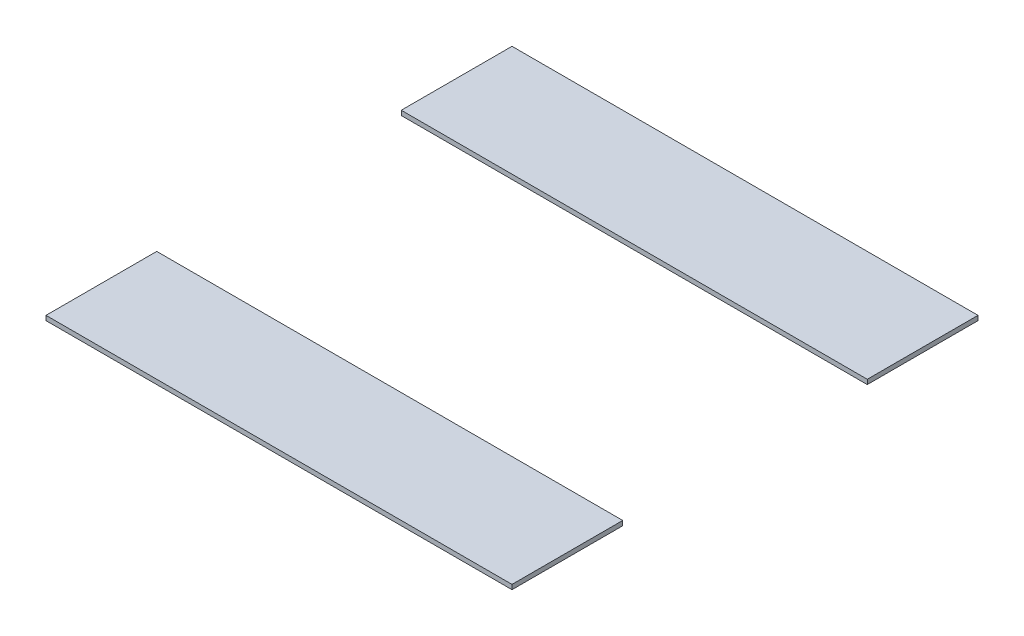
ISO-10303-21;
HEADER;
FILE_DESCRIPTION(('STEP AP214'),'2;1');
FILE_NAME('part.step','',(''),(''),'','','');
FILE_SCHEMA(('AUTOMOTIVE_DESIGN { 1 0 10303 214 1 1 1 1 }'));
ENDSEC;
DATA;
#1=APPLICATION_CONTEXT('core data for automotive mechanical design processes');
#2=APPLICATION_PROTOCOL_DEFINITION('international standard','automotive_design',2000,#1);
#3=PRODUCT_CONTEXT('',#1,'mechanical');
#4=PRODUCT('Part','Part','',(#3));
#5=PRODUCT_RELATED_PRODUCT_CATEGORY('part','',(#4));
#6=PRODUCT_DEFINITION_FORMATION('','',#4);
#7=PRODUCT_DEFINITION_CONTEXT('part definition',#1,'design');
#8=PRODUCT_DEFINITION('design','',#6,#7);
#9=PRODUCT_DEFINITION_SHAPE('','',#8);
#10=(LENGTH_UNIT() NAMED_UNIT(*) SI_UNIT(.MILLI.,.METRE.));
#11=(NAMED_UNIT(*) PLANE_ANGLE_UNIT() SI_UNIT($,.RADIAN.));
#12=(NAMED_UNIT(*) SI_UNIT($,.STERADIAN.) SOLID_ANGLE_UNIT());
#13=UNCERTAINTY_MEASURE_WITH_UNIT(LENGTH_MEASURE(1.E-05),#10,'distance_accuracy_value','');
#14=(GEOMETRIC_REPRESENTATION_CONTEXT(3) GLOBAL_UNCERTAINTY_ASSIGNED_CONTEXT((#13)) GLOBAL_UNIT_ASSIGNED_CONTEXT((#10,
#11,#12)) REPRESENTATION_CONTEXT('',''));
#15=CARTESIAN_POINT('',(0.,0.,0.));
#16=DIRECTION('',(0.,0.,1.));
#17=DIRECTION('',(1.,0.,0.));
#18=AXIS2_PLACEMENT_3D('',#15,#16,#17);
#19=CARTESIAN_POINT('',(101.,2.,-101.));
#20=DIRECTION('',(-1.,0.,0.));
#21=DIRECTION('',(0.,0.,1.));
#22=AXIS2_PLACEMENT_3D('',#19,#20,#21);
#23=PLANE('',#22);
#24=DIRECTION('',(0.,-1.,0.));
#25=VECTOR('',#24,1.);
#26=CARTESIAN_POINT('',(101.,2.,-53.));
#27=LINE('',#26,#25);
#28=CARTESIAN_POINT('',(101.,2.,-53.));
#29=VERTEX_POINT('',#28);
#30=CARTESIAN_POINT('',(101.,0.,-53.));
#31=VERTEX_POINT('',#30);
#32=EDGE_CURVE('E86',#29,#31,#27,.T.);
#33=ORIENTED_EDGE('',*,*,#32,.T.);
#34=DIRECTION('',(0.,0.,-1.));
#35=VECTOR('',#34,1.);
#36=CARTESIAN_POINT('',(101.,0.,-101.));
#37=LINE('',#36,#35);
#38=CARTESIAN_POINT('',(101.,0.,-101.));
#39=VERTEX_POINT('',#38);
#40=EDGE_CURVE('E54',#31,#39,#37,.T.);
#41=ORIENTED_EDGE('',*,*,#40,.T.);
#42=DIRECTION('',(0.,-1.,0.));
#43=VECTOR('',#42,1.);
#44=CARTESIAN_POINT('',(101.,2.,-101.));
#45=LINE('',#44,#43);
#46=CARTESIAN_POINT('',(101.,2.,-101.));
#47=VERTEX_POINT('',#46);
#48=EDGE_CURVE('E100',#47,#39,#45,.T.);
#49=ORIENTED_EDGE('',*,*,#48,.F.);
#50=DIRECTION('',(0.,0.,-1.));
#51=VECTOR('',#50,1.);
#52=CARTESIAN_POINT('',(101.,2.,-101.));
#53=LINE('',#52,#51);
#54=EDGE_CURVE('E96',#29,#47,#53,.T.);
#55=ORIENTED_EDGE('',*,*,#54,.F.);
#56=EDGE_LOOP('',(#33,#41,#49,#55));
#57=FACE_BOUND('',#56,.T.);
#58=ADVANCED_FACE('F51',(#57),#23,.F.);
#59=CARTESIAN_POINT('',(-101.,2.,-101.));
#60=DIRECTION('',(1.,0.,0.));
#61=DIRECTION('',(0.,0.,-1.));
#62=AXIS2_PLACEMENT_3D('',#59,#60,#61);
#63=PLANE('',#62);
#64=DIRECTION('',(0.,-1.,0.));
#65=VECTOR('',#64,1.);
#66=CARTESIAN_POINT('',(-101.,2.,-53.));
#67=LINE('',#66,#65);
#68=CARTESIAN_POINT('',(-101.,2.,-53.));
#69=VERTEX_POINT('',#68);
#70=CARTESIAN_POINT('',(-101.,0.,-53.));
#71=VERTEX_POINT('',#70);
#72=EDGE_CURVE('E12',#69,#71,#67,.T.);
#73=ORIENTED_EDGE('',*,*,#72,.F.);
#74=DIRECTION('',(0.,0.,1.));
#75=VECTOR('',#74,1.);
#76=CARTESIAN_POINT('',(-101.,2.,-101.));
#77=LINE('',#76,#75);
#78=CARTESIAN_POINT('',(-101.,2.,-101.));
#79=VERTEX_POINT('',#78);
#80=EDGE_CURVE('E99',#79,#69,#77,.T.);
#81=ORIENTED_EDGE('',*,*,#80,.F.);
#82=DIRECTION('',(0.,-1.,0.));
#83=VECTOR('',#82,1.);
#84=CARTESIAN_POINT('',(-101.,2.,-101.));
#85=LINE('',#84,#83);
#86=CARTESIAN_POINT('',(-101.,0.,-101.));
#87=VERTEX_POINT('',#86);
#88=EDGE_CURVE('E110',#79,#87,#85,.T.);
#89=ORIENTED_EDGE('',*,*,#88,.T.);
#90=DIRECTION('',(0.,0.,1.));
#91=VECTOR('',#90,1.);
#92=CARTESIAN_POINT('',(-101.,0.,-101.));
#93=LINE('',#92,#91);
#94=EDGE_CURVE('E107',#87,#71,#93,.T.);
#95=ORIENTED_EDGE('',*,*,#94,.T.);
#96=EDGE_LOOP('',(#73,#81,#89,#95));
#97=FACE_BOUND('',#96,.T.);
#98=ADVANCED_FACE('F125',(#97),#63,.F.);
#99=CARTESIAN_POINT('',(0.,2.,0.));
#100=DIRECTION('',(0.,1.,0.));
#101=DIRECTION('',(0.,0.,1.));
#102=AXIS2_PLACEMENT_3D('',#99,#100,#101);
#103=PLANE('',#102);
#104=ORIENTED_EDGE('',*,*,#80,.T.);
#105=DIRECTION('',(-1.,0.,0.));
#106=VECTOR('',#105,1.);
#107=CARTESIAN_POINT('',(-101.,2.,-53.));
#108=LINE('',#107,#106);
#109=EDGE_CURVE('E60',#29,#69,#108,.T.);
#110=ORIENTED_EDGE('',*,*,#109,.F.);
#111=ORIENTED_EDGE('',*,*,#54,.T.);
#112=DIRECTION('',(-1.,0.,0.));
#113=VECTOR('',#112,1.);
#114=CARTESIAN_POINT('',(-101.,2.,-101.));
#115=LINE('',#114,#113);
#116=EDGE_CURVE('E104',#47,#79,#115,.T.);
#117=ORIENTED_EDGE('',*,*,#116,.T.);
#118=EDGE_LOOP('',(#104,#110,#111,#117));
#119=FACE_BOUND('',#118,.T.);
#120=ADVANCED_FACE('F95',(#119),#103,.T.);
#121=CARTESIAN_POINT('',(0.,0.,0.));
#122=DIRECTION('',(0.,1.,0.));
#123=DIRECTION('',(0.,0.,1.));
#124=AXIS2_PLACEMENT_3D('',#121,#122,#123);
#125=PLANE('',#124);
#126=DIRECTION('',(-1.,0.,0.));
#127=VECTOR('',#126,1.);
#128=CARTESIAN_POINT('',(-101.,0.,-53.));
#129=LINE('',#128,#127);
#130=EDGE_CURVE('E84',#31,#71,#129,.T.);
#131=ORIENTED_EDGE('',*,*,#130,.T.);
#132=ORIENTED_EDGE('',*,*,#94,.F.);
#133=DIRECTION('',(-1.,0.,0.));
#134=VECTOR('',#133,1.);
#135=CARTESIAN_POINT('',(-101.,0.,-101.));
#136=LINE('',#135,#134);
#137=EDGE_CURVE('E118',#39,#87,#136,.T.);
#138=ORIENTED_EDGE('',*,*,#137,.F.);
#139=ORIENTED_EDGE('',*,*,#40,.F.);
#140=EDGE_LOOP('',(#131,#132,#138,#139));
#141=FACE_BOUND('',#140,.T.);
#142=ADVANCED_FACE('F121',(#141),#125,.F.);
#143=CARTESIAN_POINT('',(-101.,2.,-101.));
#144=DIRECTION('',(0.,0.,1.));
#145=DIRECTION('',(1.,0.,0.));
#146=AXIS2_PLACEMENT_3D('',#143,#144,#145);
#147=PLANE('',#146);
#148=ORIENTED_EDGE('',*,*,#137,.T.);
#149=ORIENTED_EDGE('',*,*,#88,.F.);
#150=ORIENTED_EDGE('',*,*,#116,.F.);
#151=ORIENTED_EDGE('',*,*,#48,.T.);
#152=EDGE_LOOP('',(#148,#149,#150,#151));
#153=FACE_BOUND('',#152,.T.);
#154=ADVANCED_FACE('F124',(#153),#147,.F.);
#155=CARTESIAN_POINT('',(-101.,2.,-53.));
#156=DIRECTION('',(0.,0.,1.));
#157=DIRECTION('',(1.,0.,0.));
#158=AXIS2_PLACEMENT_3D('',#155,#156,#157);
#159=PLANE('',#158);
#160=ORIENTED_EDGE('',*,*,#130,.F.);
#161=ORIENTED_EDGE('',*,*,#32,.F.);
#162=ORIENTED_EDGE('',*,*,#109,.T.);
#163=ORIENTED_EDGE('',*,*,#72,.T.);
#164=EDGE_LOOP('',(#160,#161,#162,#163));
#165=FACE_BOUND('',#164,.T.);
#166=ADVANCED_FACE('F88',(#165),#159,.T.);
#167=CLOSED_SHELL('',(#58,#98,#120,#142,#154,#166));
#168=MANIFOLD_SOLID_BREP('B2',#167);
#169=CARTESIAN_POINT('',(-101.,2.,101.));
#170=DIRECTION('',(0.,0.,-1.));
#171=DIRECTION('',(-1.,0.,0.));
#172=AXIS2_PLACEMENT_3D('',#169,#170,#171);
#173=PLANE('',#172);
#174=DIRECTION('',(1.,0.,0.));
#175=VECTOR('',#174,1.);
#176=CARTESIAN_POINT('',(-101.,0.,101.));
#177=LINE('',#176,#175);
#178=CARTESIAN_POINT('',(-101.,0.,101.));
#179=VERTEX_POINT('',#178);
#180=CARTESIAN_POINT('',(101.,0.,101.));
#181=VERTEX_POINT('',#180);
#182=EDGE_CURVE('E235',#179,#181,#177,.T.);
#183=ORIENTED_EDGE('',*,*,#182,.T.);
#184=DIRECTION('',(0.,-1.,0.));
#185=VECTOR('',#184,1.);
#186=CARTESIAN_POINT('',(101.,2.,101.));
#187=LINE('',#186,#185);
#188=CARTESIAN_POINT('',(101.,2.,101.));
#189=VERTEX_POINT('',#188);
#190=EDGE_CURVE('E207',#189,#181,#187,.T.);
#191=ORIENTED_EDGE('',*,*,#190,.F.);
#192=DIRECTION('',(1.,0.,0.));
#193=VECTOR('',#192,1.);
#194=CARTESIAN_POINT('',(-101.,2.,101.));
#195=LINE('',#194,#193);
#196=CARTESIAN_POINT('',(-101.,2.,101.));
#197=VERTEX_POINT('',#196);
#198=EDGE_CURVE('E223',#197,#189,#195,.T.);
#199=ORIENTED_EDGE('',*,*,#198,.F.);
#200=DIRECTION('',(0.,-1.,0.));
#201=VECTOR('',#200,1.);
#202=CARTESIAN_POINT('',(-101.,2.,101.));
#203=LINE('',#202,#201);
#204=EDGE_CURVE('E49',#197,#179,#203,.T.);
#205=ORIENTED_EDGE('',*,*,#204,.T.);
#206=EDGE_LOOP('',(#183,#191,#199,#205));
#207=FACE_BOUND('',#206,.T.);
#208=ADVANCED_FACE('F199',(#207),#173,.F.);
#209=CARTESIAN_POINT('',(0.,2.,0.));
#210=DIRECTION('',(0.,1.,0.));
#211=DIRECTION('',(0.,0.,1.));
#212=AXIS2_PLACEMENT_3D('',#209,#210,#211);
#213=PLANE('',#212);
#214=DIRECTION('',(0.,0.,-1.));
#215=VECTOR('',#214,1.);
#216=CARTESIAN_POINT('',(101.,2.,-101.));
#217=LINE('',#216,#215);
#218=CARTESIAN_POINT('',(101.,2.,53.));
#219=VERTEX_POINT('',#218);
#220=EDGE_CURVE('E242',#189,#219,#217,.T.);
#221=ORIENTED_EDGE('',*,*,#220,.T.);
#222=DIRECTION('',(1.,0.,0.));
#223=VECTOR('',#222,1.);
#224=CARTESIAN_POINT('',(-101.,2.,53.));
#225=LINE('',#224,#223);
#226=CARTESIAN_POINT('',(-101.,2.,53.));
#227=VERTEX_POINT('',#226);
#228=EDGE_CURVE('E261',#227,#219,#225,.T.);
#229=ORIENTED_EDGE('',*,*,#228,.F.);
#230=DIRECTION('',(0.,0.,1.));
#231=VECTOR('',#230,1.);
#232=CARTESIAN_POINT('',(-101.,2.,-101.));
#233=LINE('',#232,#231);
#234=EDGE_CURVE('E257',#227,#197,#233,.T.);
#235=ORIENTED_EDGE('',*,*,#234,.T.);
#236=ORIENTED_EDGE('',*,*,#198,.T.);
#237=EDGE_LOOP('',(#221,#229,#235,#236));
#238=FACE_BOUND('',#237,.T.);
#239=ADVANCED_FACE('F269',(#238),#213,.T.);
#240=CARTESIAN_POINT('',(0.,0.,0.));
#241=DIRECTION('',(0.,1.,0.));
#242=DIRECTION('',(0.,0.,1.));
#243=AXIS2_PLACEMENT_3D('',#240,#241,#242);
#244=PLANE('',#243);
#245=DIRECTION('',(1.,0.,0.));
#246=VECTOR('',#245,1.);
#247=CARTESIAN_POINT('',(-101.,0.,53.));
#248=LINE('',#247,#246);
#249=CARTESIAN_POINT('',(-101.,0.,53.));
#250=VERTEX_POINT('',#249);
#251=CARTESIAN_POINT('',(101.,0.,53.));
#252=VERTEX_POINT('',#251);
#253=EDGE_CURVE('E249',#250,#252,#248,.T.);
#254=ORIENTED_EDGE('',*,*,#253,.T.);
#255=DIRECTION('',(0.,0.,-1.));
#256=VECTOR('',#255,1.);
#257=CARTESIAN_POINT('',(101.,0.,-101.));
#258=LINE('',#257,#256);
#259=EDGE_CURVE('E247',#181,#252,#258,.T.);
#260=ORIENTED_EDGE('',*,*,#259,.F.);
#261=ORIENTED_EDGE('',*,*,#182,.F.);
#262=DIRECTION('',(0.,0.,1.));
#263=VECTOR('',#262,1.);
#264=CARTESIAN_POINT('',(-101.,0.,-101.));
#265=LINE('',#264,#263);
#266=EDGE_CURVE('E243',#250,#179,#265,.T.);
#267=ORIENTED_EDGE('',*,*,#266,.F.);
#268=EDGE_LOOP('',(#254,#260,#261,#267));
#269=FACE_BOUND('',#268,.T.);
#270=ADVANCED_FACE('F248',(#269),#244,.F.);
#271=CARTESIAN_POINT('',(-101.,2.,-101.));
#272=DIRECTION('',(1.,0.,0.));
#273=DIRECTION('',(0.,0.,-1.));
#274=AXIS2_PLACEMENT_3D('',#271,#272,#273);
#275=PLANE('',#274);
#276=DIRECTION('',(0.,-1.,0.));
#277=VECTOR('',#276,1.);
#278=CARTESIAN_POINT('',(-101.,2.,53.));
#279=LINE('',#278,#277);
#280=EDGE_CURVE('E250',#227,#250,#279,.T.);
#281=ORIENTED_EDGE('',*,*,#280,.T.);
#282=ORIENTED_EDGE('',*,*,#266,.T.);
#283=ORIENTED_EDGE('',*,*,#204,.F.);
#284=ORIENTED_EDGE('',*,*,#234,.F.);
#285=EDGE_LOOP('',(#281,#282,#283,#284));
#286=FACE_BOUND('',#285,.T.);
#287=ADVANCED_FACE('F276',(#286),#275,.F.);
#288=CARTESIAN_POINT('',(101.,2.,-101.));
#289=DIRECTION('',(-1.,0.,0.));
#290=DIRECTION('',(0.,0.,1.));
#291=AXIS2_PLACEMENT_3D('',#288,#289,#290);
#292=PLANE('',#291);
#293=DIRECTION('',(0.,-1.,0.));
#294=VECTOR('',#293,1.);
#295=CARTESIAN_POINT('',(101.,2.,53.));
#296=LINE('',#295,#294);
#297=EDGE_CURVE('E214',#219,#252,#296,.T.);
#298=ORIENTED_EDGE('',*,*,#297,.F.);
#299=ORIENTED_EDGE('',*,*,#220,.F.);
#300=ORIENTED_EDGE('',*,*,#190,.T.);
#301=ORIENTED_EDGE('',*,*,#259,.T.);
#302=EDGE_LOOP('',(#298,#299,#300,#301));
#303=FACE_BOUND('',#302,.T.);
#304=ADVANCED_FACE('F201',(#303),#292,.F.);
#305=CARTESIAN_POINT('',(-101.,2.,53.));
#306=DIRECTION('',(0.,0.,-1.));
#307=DIRECTION('',(-1.,0.,0.));
#308=AXIS2_PLACEMENT_3D('',#305,#306,#307);
#309=PLANE('',#308);
#310=ORIENTED_EDGE('',*,*,#253,.F.);
#311=ORIENTED_EDGE('',*,*,#280,.F.);
#312=ORIENTED_EDGE('',*,*,#228,.T.);
#313=ORIENTED_EDGE('',*,*,#297,.T.);
#314=EDGE_LOOP('',(#310,#311,#312,#313));
#315=FACE_BOUND('',#314,.T.);
#316=ADVANCED_FACE('F265',(#315),#309,.T.);
#317=CLOSED_SHELL('',(#208,#239,#270,#287,#304,#316));
#318=MANIFOLD_SOLID_BREP('B6',#317);
#319=ADVANCED_BREP_SHAPE_REPRESENTATION('',(#18,#168,#318),#14);
#320=SHAPE_DEFINITION_REPRESENTATION(#9,#319);
ENDSEC;
END-ISO-10303-21;
